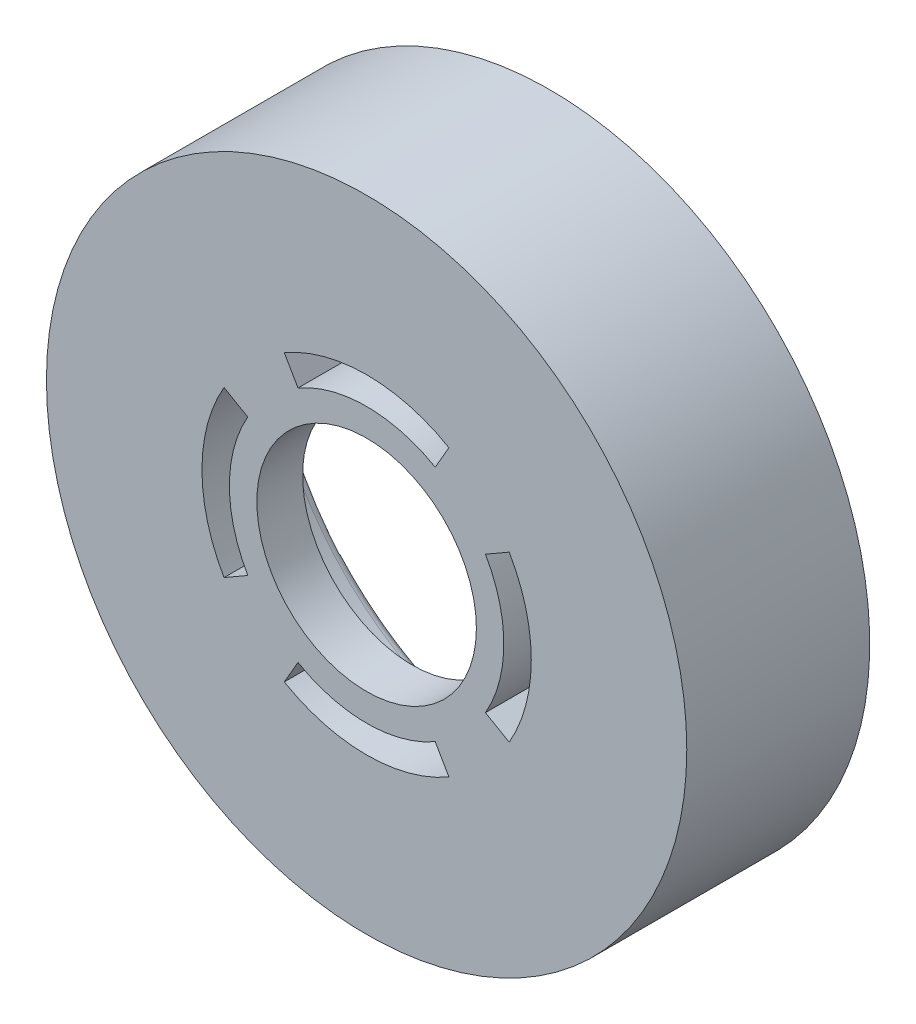
ISO-10303-21;
HEADER;
FILE_DESCRIPTION(('STEP AP214'),'2;1');
FILE_NAME('part.step','',(''),(''),'','','');
FILE_SCHEMA(('AUTOMOTIVE_DESIGN { 1 0 10303 214 1 1 1 1 }'));
ENDSEC;
DATA;
#1=APPLICATION_CONTEXT('core data for automotive mechanical design processes');
#2=APPLICATION_PROTOCOL_DEFINITION('international standard','automotive_design',2000,#1);
#3=PRODUCT_CONTEXT('',#1,'mechanical');
#4=PRODUCT('Part','Part','',(#3));
#5=PRODUCT_RELATED_PRODUCT_CATEGORY('part','',(#4));
#6=PRODUCT_DEFINITION_FORMATION('','',#4);
#7=PRODUCT_DEFINITION_CONTEXT('part definition',#1,'design');
#8=PRODUCT_DEFINITION('design','',#6,#7);
#9=PRODUCT_DEFINITION_SHAPE('','',#8);
#10=(LENGTH_UNIT() NAMED_UNIT(*) SI_UNIT(.MILLI.,.METRE.));
#11=(NAMED_UNIT(*) PLANE_ANGLE_UNIT() SI_UNIT($,.RADIAN.));
#12=(NAMED_UNIT(*) SI_UNIT($,.STERADIAN.) SOLID_ANGLE_UNIT());
#13=UNCERTAINTY_MEASURE_WITH_UNIT(LENGTH_MEASURE(1.E-05),#10,'distance_accuracy_value','');
#14=(GEOMETRIC_REPRESENTATION_CONTEXT(3) GLOBAL_UNCERTAINTY_ASSIGNED_CONTEXT((#13)) GLOBAL_UNIT_ASSIGNED_CONTEXT((#10,
#11,#12)) REPRESENTATION_CONTEXT('',''));
#15=CARTESIAN_POINT('',(0.,0.,0.));
#16=DIRECTION('',(0.,0.,1.));
#17=DIRECTION('',(1.,0.,0.));
#18=AXIS2_PLACEMENT_3D('',#15,#16,#17);
#19=CARTESIAN_POINT('',(0.,0.,0.));
#20=DIRECTION('',(0.,0.,1.));
#21=DIRECTION('',(1.,0.,0.));
#22=AXIS2_PLACEMENT_3D('',#19,#20,#21);
#23=PLANE('',#22);
#24=DIRECTION('',(-0.500000000000002,0.866025403784438,0.));
#25=VECTOR('',#24,1.);
#26=CARTESIAN_POINT('',(-7.50000000000002,12.9903810567666,0.));
#27=LINE('',#26,#25);
#28=CARTESIAN_POINT('',(-7.50000000000003,12.9903810567666,0.));
#29=VERTEX_POINT('',#28);
#30=CARTESIAN_POINT('',(-9.00000000000003,15.5884572681199,0.));
#31=VERTEX_POINT('',#30);
#32=EDGE_CURVE('E218',#29,#31,#27,.T.);
#33=ORIENTED_EDGE('',*,*,#32,.F.);
#34=CARTESIAN_POINT('',(0.,0.,0.));
#35=DIRECTION('',(0.,0.,1.));
#36=DIRECTION('',(-1.,0.,0.));
#37=AXIS2_PLACEMENT_3D('',#34,#35,#36);
#38=CIRCLE('',#37,15.);
#39=CARTESIAN_POINT('',(7.50000000000002,12.9903810567666,0.));
#40=VERTEX_POINT('',#39);
#41=EDGE_CURVE('E60',#40,#29,#38,.T.);
#42=ORIENTED_EDGE('',*,*,#41,.F.);
#43=DIRECTION('',(-0.500000000000001,-0.866025403784438,0.));
#44=VECTOR('',#43,1.);
#45=CARTESIAN_POINT('',(7.50000000000002,12.9903810567666,0.));
#46=LINE('',#45,#44);
#47=CARTESIAN_POINT('',(9.00000000000002,15.5884572681199,0.));
#48=VERTEX_POINT('',#47);
#49=EDGE_CURVE('E205',#48,#40,#46,.T.);
#50=ORIENTED_EDGE('',*,*,#49,.F.);
#51=CARTESIAN_POINT('',(0.,0.,0.));
#52=DIRECTION('',(0.,0.,-1.));
#53=DIRECTION('',(-1.,0.,0.));
#54=AXIS2_PLACEMENT_3D('',#51,#52,#53);
#55=CIRCLE('',#54,18.);
#56=EDGE_CURVE('E209',#31,#48,#55,.T.);
#57=ORIENTED_EDGE('',*,*,#56,.F.);
#58=EDGE_LOOP('',(#33,#42,#50,#57));
#59=FACE_BOUND('',#58,.T.);
#60=DIRECTION('',(-0.866025403784436,-0.500000000000005,0.));
#61=VECTOR('',#60,1.);
#62=CARTESIAN_POINT('',(-12.9903810567665,-7.50000000000007,0.));
#63=LINE('',#62,#61);
#64=CARTESIAN_POINT('',(-12.9903810567665,-7.50000000000007,0.));
#65=VERTEX_POINT('',#64);
#66=CARTESIAN_POINT('',(-15.5884572681199,-9.00000000000008,0.));
#67=VERTEX_POINT('',#66);
#68=EDGE_CURVE('E254',#65,#67,#63,.T.);
#69=ORIENTED_EDGE('',*,*,#68,.F.);
#70=CARTESIAN_POINT('',(0.,0.,0.));
#71=DIRECTION('',(0.,0.,1.));
#72=DIRECTION('',(-1.,0.,0.));
#73=AXIS2_PLACEMENT_3D('',#70,#71,#72);
#74=CIRCLE('',#73,15.);
#75=CARTESIAN_POINT('',(-12.9903810567666,7.49999999999997,0.));
#76=VERTEX_POINT('',#75);
#77=EDGE_CURVE('E68',#76,#65,#74,.T.);
#78=ORIENTED_EDGE('',*,*,#77,.F.);
#79=DIRECTION('',(0.86602540378444,-0.499999999999998,0.));
#80=VECTOR('',#79,1.);
#81=CARTESIAN_POINT('',(-12.9903810567666,7.49999999999997,0.));
#82=LINE('',#81,#80);
#83=CARTESIAN_POINT('',(-15.5884572681199,8.99999999999997,0.));
#84=VERTEX_POINT('',#83);
#85=EDGE_CURVE('E239',#84,#76,#82,.T.);
#86=ORIENTED_EDGE('',*,*,#85,.F.);
#87=CARTESIAN_POINT('',(0.,0.,0.));
#88=DIRECTION('',(0.,0.,-1.));
#89=DIRECTION('',(-1.,0.,0.));
#90=AXIS2_PLACEMENT_3D('',#87,#88,#89);
#91=CIRCLE('',#90,18.);
#92=EDGE_CURVE('E259',#67,#84,#91,.T.);
#93=ORIENTED_EDGE('',*,*,#92,.F.);
#94=EDGE_LOOP('',(#69,#78,#86,#93));
#95=FACE_BOUND('',#94,.T.);
#96=DIRECTION('',(0.500000000000008,-0.866025403784434,0.));
#97=VECTOR('',#96,1.);
#98=CARTESIAN_POINT('',(7.50000000000011,-12.9903810567665,0.));
#99=LINE('',#98,#97);
#100=CARTESIAN_POINT('',(7.50000000000012,-12.9903810567665,0.));
#101=VERTEX_POINT('',#100);
#102=CARTESIAN_POINT('',(9.00000000000013,-15.5884572681198,0.));
#103=VERTEX_POINT('',#102);
#104=EDGE_CURVE('E297',#101,#103,#99,.T.);
#105=ORIENTED_EDGE('',*,*,#104,.F.);
#106=CARTESIAN_POINT('',(0.,0.,0.));
#107=DIRECTION('',(0.,0.,1.));
#108=DIRECTION('',(-1.,0.,0.));
#109=AXIS2_PLACEMENT_3D('',#106,#107,#108);
#110=CIRCLE('',#109,15.);
#111=CARTESIAN_POINT('',(-7.49999999999993,-12.9903810567666,0.));
#112=VERTEX_POINT('',#111);
#113=EDGE_CURVE('E294',#112,#101,#110,.T.);
#114=ORIENTED_EDGE('',*,*,#113,.F.);
#115=DIRECTION('',(0.499999999999995,0.866025403784441,0.));
#116=VECTOR('',#115,1.);
#117=CARTESIAN_POINT('',(-7.49999999999993,-12.9903810567666,0.));
#118=LINE('',#117,#116);
#119=CARTESIAN_POINT('',(-8.99999999999992,-15.5884572681199,0.));
#120=VERTEX_POINT('',#119);
#121=EDGE_CURVE('E281',#120,#112,#118,.T.);
#122=ORIENTED_EDGE('',*,*,#121,.F.);
#123=CARTESIAN_POINT('',(0.,0.,0.));
#124=DIRECTION('',(0.,0.,-1.));
#125=DIRECTION('',(-1.,0.,0.));
#126=AXIS2_PLACEMENT_3D('',#123,#124,#125);
#127=CIRCLE('',#126,18.);
#128=EDGE_CURVE('E302',#103,#120,#127,.T.);
#129=ORIENTED_EDGE('',*,*,#128,.F.);
#130=EDGE_LOOP('',(#105,#114,#122,#129));
#131=FACE_BOUND('',#130,.T.);
#132=DIRECTION('',(0.866025403784432,0.500000000000011,0.));
#133=VECTOR('',#132,1.);
#134=CARTESIAN_POINT('',(12.9903810567665,7.50000000000016,0.));
#135=LINE('',#134,#133);
#136=CARTESIAN_POINT('',(12.9903810567665,7.50000000000016,0.));
#137=VERTEX_POINT('',#136);
#138=CARTESIAN_POINT('',(15.5884572681198,9.0000000000002,0.));
#139=VERTEX_POINT('',#138);
#140=EDGE_CURVE('E341',#137,#139,#135,.T.);
#141=ORIENTED_EDGE('',*,*,#140,.F.);
#142=CARTESIAN_POINT('',(0.,0.,0.));
#143=DIRECTION('',(0.,0.,1.));
#144=DIRECTION('',(-1.,0.,0.));
#145=AXIS2_PLACEMENT_3D('',#142,#143,#144);
#146=CIRCLE('',#145,15.);
#147=CARTESIAN_POINT('',(12.9903810567666,-7.49999999999988,0.));
#148=VERTEX_POINT('',#147);
#149=EDGE_CURVE('E338',#148,#137,#146,.T.);
#150=ORIENTED_EDGE('',*,*,#149,.F.);
#151=DIRECTION('',(-0.866025403784443,0.499999999999992,0.));
#152=VECTOR('',#151,1.);
#153=CARTESIAN_POINT('',(12.9903810567666,-7.49999999999988,0.));
#154=LINE('',#153,#152);
#155=CARTESIAN_POINT('',(15.58845726812,-8.99999999999986,0.));
#156=VERTEX_POINT('',#155);
#157=EDGE_CURVE('E325',#156,#148,#154,.T.);
#158=ORIENTED_EDGE('',*,*,#157,.F.);
#159=CARTESIAN_POINT('',(0.,0.,0.));
#160=DIRECTION('',(0.,0.,-1.));
#161=DIRECTION('',(-1.,0.,0.));
#162=AXIS2_PLACEMENT_3D('',#159,#160,#161);
#163=CIRCLE('',#162,18.);
#164=EDGE_CURVE('E345',#139,#156,#163,.T.);
#165=ORIENTED_EDGE('',*,*,#164,.F.);
#166=EDGE_LOOP('',(#141,#150,#158,#165));
#167=FACE_BOUND('',#166,.T.);
#168=CARTESIAN_POINT('',(0.,0.,0.));
#169=DIRECTION('',(0.,0.,1.));
#170=DIRECTION('',(1.,0.,0.));
#171=AXIS2_PLACEMENT_3D('',#168,#169,#170);
#172=CIRCLE('',#171,12.);
#173=CARTESIAN_POINT('',(12.,0.,0.));
#174=VERTEX_POINT('',#173);
#175=EDGE_CURVE('E402',#174,#174,#172,.T.);
#176=ORIENTED_EDGE('',*,*,#175,.T.);
#177=EDGE_LOOP('',(#176));
#178=FACE_BOUND('',#177,.T.);
#179=CARTESIAN_POINT('',(0.,0.,0.));
#180=DIRECTION('',(0.,0.,-1.));
#181=DIRECTION('',(-1.,0.,0.));
#182=AXIS2_PLACEMENT_3D('',#179,#180,#181);
#183=CIRCLE('',#182,30.05);
#184=CARTESIAN_POINT('',(-30.05,0.,0.));
#185=VERTEX_POINT('',#184);
#186=EDGE_CURVE('E367',#185,#185,#183,.T.);
#187=ORIENTED_EDGE('',*,*,#186,.T.);
#188=EDGE_LOOP('',(#187));
#189=FACE_BOUND('',#188,.T.);
#190=ADVANCED_FACE('F38',(#59,#95,#131,#167,#178,#189),#23,.F.);
#191=CARTESIAN_POINT('',(0.,0.,5.));
#192=DIRECTION('',(0.,0.,1.));
#193=DIRECTION('',(1.,0.,0.));
#194=AXIS2_PLACEMENT_3D('',#191,#192,#193);
#195=PLANE('',#194);
#196=CARTESIAN_POINT('',(0.,0.,5.));
#197=DIRECTION('',(0.,0.,1.));
#198=DIRECTION('',(-1.,0.,0.));
#199=AXIS2_PLACEMENT_3D('',#196,#197,#198);
#200=CIRCLE('',#199,15.);
#201=CARTESIAN_POINT('',(7.50000000000002,12.9903810567666,5.));
#202=VERTEX_POINT('',#201);
#203=CARTESIAN_POINT('',(-7.50000000000002,12.9903810567666,5.));
#204=VERTEX_POINT('',#203);
#205=EDGE_CURVE('E183',#202,#204,#200,.T.);
#206=ORIENTED_EDGE('',*,*,#205,.T.);
#207=DIRECTION('',(-0.500000000000002,0.866025403784438,0.));
#208=VECTOR('',#207,1.);
#209=CARTESIAN_POINT('',(-7.50000000000002,12.9903810567666,5.));
#210=LINE('',#209,#208);
#211=CARTESIAN_POINT('',(-9.00000000000003,15.5884572681199,5.));
#212=VERTEX_POINT('',#211);
#213=EDGE_CURVE('E194',#204,#212,#210,.T.);
#214=ORIENTED_EDGE('',*,*,#213,.T.);
#215=CARTESIAN_POINT('',(0.,0.,5.));
#216=DIRECTION('',(0.,0.,-1.));
#217=DIRECTION('',(-1.,0.,0.));
#218=AXIS2_PLACEMENT_3D('',#215,#216,#217);
#219=CIRCLE('',#218,18.);
#220=CARTESIAN_POINT('',(9.00000000000002,15.5884572681199,5.));
#221=VERTEX_POINT('',#220);
#222=EDGE_CURVE('E199',#212,#221,#219,.T.);
#223=ORIENTED_EDGE('',*,*,#222,.T.);
#224=DIRECTION('',(-0.500000000000001,-0.866025403784438,0.));
#225=VECTOR('',#224,1.);
#226=CARTESIAN_POINT('',(7.50000000000002,12.9903810567666,5.));
#227=LINE('',#226,#225);
#228=EDGE_CURVE('E190',#221,#202,#227,.T.);
#229=ORIENTED_EDGE('',*,*,#228,.T.);
#230=EDGE_LOOP('',(#206,#214,#223,#229));
#231=FACE_BOUND('',#230,.T.);
#232=CARTESIAN_POINT('',(0.,0.,5.));
#233=DIRECTION('',(0.,0.,1.));
#234=DIRECTION('',(-1.,0.,0.));
#235=AXIS2_PLACEMENT_3D('',#232,#233,#234);
#236=CIRCLE('',#235,15.);
#237=CARTESIAN_POINT('',(-12.9903810567666,7.49999999999997,5.));
#238=VERTEX_POINT('',#237);
#239=CARTESIAN_POINT('',(-12.9903810567665,-7.50000000000007,5.));
#240=VERTEX_POINT('',#239);
#241=EDGE_CURVE('E234',#238,#240,#236,.T.);
#242=ORIENTED_EDGE('',*,*,#241,.T.);
#243=DIRECTION('',(-0.866025403784436,-0.500000000000005,0.));
#244=VECTOR('',#243,1.);
#245=CARTESIAN_POINT('',(-12.9903810567665,-7.50000000000007,5.));
#246=LINE('',#245,#244);
#247=CARTESIAN_POINT('',(-15.5884572681199,-9.00000000000008,5.));
#248=VERTEX_POINT('',#247);
#249=EDGE_CURVE('E238',#240,#248,#246,.T.);
#250=ORIENTED_EDGE('',*,*,#249,.T.);
#251=CARTESIAN_POINT('',(0.,0.,5.));
#252=DIRECTION('',(0.,0.,-1.));
#253=DIRECTION('',(-1.,0.,0.));
#254=AXIS2_PLACEMENT_3D('',#251,#252,#253);
#255=CIRCLE('',#254,18.);
#256=CARTESIAN_POINT('',(-15.5884572681199,8.99999999999997,5.));
#257=VERTEX_POINT('',#256);
#258=EDGE_CURVE('E243',#248,#257,#255,.T.);
#259=ORIENTED_EDGE('',*,*,#258,.T.);
#260=DIRECTION('',(0.86602540378444,-0.499999999999998,0.));
#261=VECTOR('',#260,1.);
#262=CARTESIAN_POINT('',(-12.9903810567666,7.49999999999997,5.));
#263=LINE('',#262,#261);
#264=EDGE_CURVE('E247',#257,#238,#263,.T.);
#265=ORIENTED_EDGE('',*,*,#264,.T.);
#266=EDGE_LOOP('',(#242,#250,#259,#265));
#267=FACE_BOUND('',#266,.T.);
#268=CARTESIAN_POINT('',(0.,0.,5.));
#269=DIRECTION('',(0.,0.,1.));
#270=DIRECTION('',(-1.,0.,0.));
#271=AXIS2_PLACEMENT_3D('',#268,#269,#270);
#272=CIRCLE('',#271,15.);
#273=CARTESIAN_POINT('',(-7.49999999999993,-12.9903810567666,5.));
#274=VERTEX_POINT('',#273);
#275=CARTESIAN_POINT('',(7.50000000000011,-12.9903810567665,5.));
#276=VERTEX_POINT('',#275);
#277=EDGE_CURVE('E276',#274,#276,#272,.T.);
#278=ORIENTED_EDGE('',*,*,#277,.T.);
#279=DIRECTION('',(0.500000000000008,-0.866025403784434,0.));
#280=VECTOR('',#279,1.);
#281=CARTESIAN_POINT('',(7.50000000000011,-12.9903810567665,5.));
#282=LINE('',#281,#280);
#283=CARTESIAN_POINT('',(9.00000000000014,-15.5884572681198,5.));
#284=VERTEX_POINT('',#283);
#285=EDGE_CURVE('E280',#276,#284,#282,.T.);
#286=ORIENTED_EDGE('',*,*,#285,.T.);
#287=CARTESIAN_POINT('',(0.,0.,5.));
#288=DIRECTION('',(0.,0.,-1.));
#289=DIRECTION('',(-1.,0.,0.));
#290=AXIS2_PLACEMENT_3D('',#287,#288,#289);
#291=CIRCLE('',#290,18.);
#292=CARTESIAN_POINT('',(-8.99999999999992,-15.5884572681199,5.));
#293=VERTEX_POINT('',#292);
#294=EDGE_CURVE('E285',#284,#293,#291,.T.);
#295=ORIENTED_EDGE('',*,*,#294,.T.);
#296=DIRECTION('',(0.499999999999995,0.866025403784441,0.));
#297=VECTOR('',#296,1.);
#298=CARTESIAN_POINT('',(-7.49999999999993,-12.9903810567666,5.));
#299=LINE('',#298,#297);
#300=EDGE_CURVE('E289',#293,#274,#299,.T.);
#301=ORIENTED_EDGE('',*,*,#300,.T.);
#302=EDGE_LOOP('',(#278,#286,#295,#301));
#303=FACE_BOUND('',#302,.T.);
#304=CARTESIAN_POINT('',(0.,0.,5.));
#305=DIRECTION('',(0.,0.,1.));
#306=DIRECTION('',(-1.,0.,0.));
#307=AXIS2_PLACEMENT_3D('',#304,#305,#306);
#308=CIRCLE('',#307,15.);
#309=CARTESIAN_POINT('',(12.9903810567666,-7.49999999999988,5.));
#310=VERTEX_POINT('',#309);
#311=CARTESIAN_POINT('',(12.9903810567665,7.50000000000016,5.));
#312=VERTEX_POINT('',#311);
#313=EDGE_CURVE('E320',#310,#312,#308,.T.);
#314=ORIENTED_EDGE('',*,*,#313,.T.);
#315=DIRECTION('',(0.866025403784432,0.500000000000011,0.));
#316=VECTOR('',#315,1.);
#317=CARTESIAN_POINT('',(12.9903810567665,7.50000000000016,5.));
#318=LINE('',#317,#316);
#319=CARTESIAN_POINT('',(15.5884572681198,9.00000000000019,5.));
#320=VERTEX_POINT('',#319);
#321=EDGE_CURVE('E324',#312,#320,#318,.T.);
#322=ORIENTED_EDGE('',*,*,#321,.T.);
#323=CARTESIAN_POINT('',(0.,0.,5.));
#324=DIRECTION('',(0.,0.,-1.));
#325=DIRECTION('',(-1.,0.,0.));
#326=AXIS2_PLACEMENT_3D('',#323,#324,#325);
#327=CIRCLE('',#326,18.);
#328=CARTESIAN_POINT('',(15.58845726812,-8.99999999999986,5.));
#329=VERTEX_POINT('',#328);
#330=EDGE_CURVE('E329',#320,#329,#327,.T.);
#331=ORIENTED_EDGE('',*,*,#330,.T.);
#332=DIRECTION('',(-0.866025403784443,0.499999999999992,0.));
#333=VECTOR('',#332,1.);
#334=CARTESIAN_POINT('',(12.9903810567666,-7.49999999999988,5.));
#335=LINE('',#334,#333);
#336=EDGE_CURVE('E333',#329,#310,#335,.T.);
#337=ORIENTED_EDGE('',*,*,#336,.T.);
#338=EDGE_LOOP('',(#314,#322,#331,#337));
#339=FACE_BOUND('',#338,.T.);
#340=CARTESIAN_POINT('',(0.,0.,5.));
#341=DIRECTION('',(0.,0.,1.));
#342=DIRECTION('',(1.,0.,0.));
#343=AXIS2_PLACEMENT_3D('',#340,#341,#342);
#344=CIRCLE('',#343,35.);
#345=CARTESIAN_POINT('',(35.,0.,5.));
#346=VERTEX_POINT('',#345);
#347=EDGE_CURVE('E407',#346,#346,#344,.T.);
#348=ORIENTED_EDGE('',*,*,#347,.T.);
#349=EDGE_LOOP('',(#348));
#350=FACE_BOUND('',#349,.T.);
#351=CARTESIAN_POINT('',(0.,0.,5.));
#352=DIRECTION('',(0.,0.,1.));
#353=DIRECTION('',(1.,0.,0.));
#354=AXIS2_PLACEMENT_3D('',#351,#352,#353);
#355=CIRCLE('',#354,12.);
#356=CARTESIAN_POINT('',(12.,0.,5.));
#357=VERTEX_POINT('',#356);
#358=EDGE_CURVE('E403',#357,#357,#355,.T.);
#359=ORIENTED_EDGE('',*,*,#358,.F.);
#360=EDGE_LOOP('',(#359));
#361=FACE_BOUND('',#360,.T.);
#362=ADVANCED_FACE('F201',(#231,#267,#303,#339,#350,#361),#195,.T.);
#363=CARTESIAN_POINT('',(0.,0.,5.));
#364=DIRECTION('',(0.,0.,-1.));
#365=DIRECTION('',(-1.,0.,0.));
#366=AXIS2_PLACEMENT_3D('',#363,#364,#365);
#367=CYLINDRICAL_SURFACE('',#366,35.);
#368=ORIENTED_EDGE('',*,*,#347,.F.);
#369=EDGE_LOOP('',(#368));
#370=FACE_BOUND('',#369,.T.);
#371=CARTESIAN_POINT('',(0.,0.,-15.));
#372=DIRECTION('',(0.,0.,-1.));
#373=DIRECTION('',(-1.,0.,0.));
#374=AXIS2_PLACEMENT_3D('',#371,#372,#373);
#375=CIRCLE('',#374,35.);
#376=CARTESIAN_POINT('',(-35.,0.,-15.));
#377=VERTEX_POINT('',#376);
#378=EDGE_CURVE('E398',#377,#377,#375,.T.);
#379=ORIENTED_EDGE('',*,*,#378,.F.);
#380=EDGE_LOOP('',(#379));
#381=FACE_BOUND('',#380,.T.);
#382=ADVANCED_FACE('F463',(#370,#381),#367,.T.);
#383=CARTESIAN_POINT('',(0.,0.,5.));
#384=DIRECTION('',(0.,0.,-1.));
#385=DIRECTION('',(-1.,0.,0.));
#386=AXIS2_PLACEMENT_3D('',#383,#384,#385);
#387=CYLINDRICAL_SURFACE('',#386,12.);
#388=ORIENTED_EDGE('',*,*,#358,.T.);
#389=EDGE_LOOP('',(#388));
#390=FACE_BOUND('',#389,.T.);
#391=ORIENTED_EDGE('',*,*,#175,.F.);
#392=EDGE_LOOP('',(#391));
#393=FACE_BOUND('',#392,.T.);
#394=ADVANCED_FACE('F459',(#390,#393),#387,.F.);
#395=CARTESIAN_POINT('',(0.,0.,-15.));
#396=DIRECTION('',(0.,0.,-1.));
#397=DIRECTION('',(-1.,0.,0.));
#398=AXIS2_PLACEMENT_3D('',#395,#396,#397);
#399=PLANE('',#398);
#400=CARTESIAN_POINT('',(-1.83547080668457E-12,-32.5,-15.));
#401=DIRECTION('',(0.,0.,-1.));
#402=DIRECTION('',(-1.,0.,0.));
#403=AXIS2_PLACEMENT_3D('',#400,#401,#402);
#404=CIRCLE('',#403,1.55000000000197);
#405=CARTESIAN_POINT('',(0.535344826111361,-31.0453846153846,-15.));
#406=VERTEX_POINT('',#405);
#407=CARTESIAN_POINT('',(-0.535344826114868,-31.0453846153845,-15.));
#408=VERTEX_POINT('',#407);
#409=EDGE_CURVE('E384',#406,#408,#404,.T.);
#410=ORIENTED_EDGE('',*,*,#409,.F.);
#411=CARTESIAN_POINT('',(0.,0.,-15.));
#412=DIRECTION('',(0.,0.,-1.));
#413=DIRECTION('',(-1.,0.,0.));
#414=AXIS2_PLACEMENT_3D('',#411,#412,#413);
#415=CIRCLE('',#414,31.05);
#416=CARTESIAN_POINT('',(31.0453846153845,-0.535344826114989,-15.));
#417=VERTEX_POINT('',#416);
#418=EDGE_CURVE('E427',#406,#417,#415,.F.);
#419=ORIENTED_EDGE('',*,*,#418,.T.);
#420=CARTESIAN_POINT('',(32.4999999999991,-9.21715505439516E-13,-15.));
#421=DIRECTION('',(0.,0.,-1.));
#422=DIRECTION('',(-1.,0.,0.));
#423=AXIS2_PLACEMENT_3D('',#420,#421,#422);
#424=CIRCLE('',#423,1.55000000000148);
#425=CARTESIAN_POINT('',(31.0453846153845,0.535344826113227,-15.));
#426=VERTEX_POINT('',#425);
#427=EDGE_CURVE('E228',#426,#417,#424,.T.);
#428=ORIENTED_EDGE('',*,*,#427,.F.);
#429=CARTESIAN_POINT('',(0.,0.,-15.));
#430=DIRECTION('',(0.,0.,-1.));
#431=DIRECTION('',(-1.,0.,0.));
#432=AXIS2_PLACEMENT_3D('',#429,#430,#431);
#433=CIRCLE('',#432,31.05);
#434=CARTESIAN_POINT('',(0.535344826107665,31.0453846153846,-15.));
#435=VERTEX_POINT('',#434);
#436=EDGE_CURVE('E424',#426,#435,#433,.F.);
#437=ORIENTED_EDGE('',*,*,#436,.T.);
#438=CARTESIAN_POINT('',(0.,32.5,-15.));
#439=DIRECTION('',(0.,0.,-1.));
#440=DIRECTION('',(-1.,0.,0.));
#441=AXIS2_PLACEMENT_3D('',#438,#439,#440);
#442=CIRCLE('',#441,1.55);
#443=CARTESIAN_POINT('',(-0.535344826107665,31.0453846153846,-15.));
#444=VERTEX_POINT('',#443);
#445=EDGE_CURVE('E368',#444,#435,#442,.T.);
#446=ORIENTED_EDGE('',*,*,#445,.F.);
#447=CARTESIAN_POINT('',(0.,0.,-15.));
#448=DIRECTION('',(0.,0.,-1.));
#449=DIRECTION('',(-1.,0.,0.));
#450=AXIS2_PLACEMENT_3D('',#447,#448,#449);
#451=CIRCLE('',#450,31.05);
#452=CARTESIAN_POINT('',(-31.0453846153846,0.535344826108146,-15.));
#453=VERTEX_POINT('',#452);
#454=EDGE_CURVE('E421',#444,#453,#451,.F.);
#455=ORIENTED_EDGE('',*,*,#454,.T.);
#456=CARTESIAN_POINT('',(-32.5000000000009,9.17735403342287E-13,-15.));
#457=DIRECTION('',(0.,0.,-1.));
#458=DIRECTION('',(-1.,0.,0.));
#459=AXIS2_PLACEMENT_3D('',#456,#457,#458);
#460=CIRCLE('',#459,1.55000000000072);
#461=CARTESIAN_POINT('',(-31.0453846153846,-0.535344826106392,-15.));
#462=VERTEX_POINT('',#461);
#463=EDGE_CURVE('E376',#462,#453,#460,.T.);
#464=ORIENTED_EDGE('',*,*,#463,.F.);
#465=CARTESIAN_POINT('',(0.,0.,-15.));
#466=DIRECTION('',(0.,0.,-1.));
#467=DIRECTION('',(-1.,0.,0.));
#468=AXIS2_PLACEMENT_3D('',#465,#466,#467);
#469=CIRCLE('',#468,31.05);
#470=EDGE_CURVE('E418',#462,#408,#469,.F.);
#471=ORIENTED_EDGE('',*,*,#470,.T.);
#472=EDGE_LOOP('',(#410,#419,#428,#437,#446,#455,#464,#471));
#473=FACE_BOUND('',#472,.T.);
#474=ORIENTED_EDGE('',*,*,#378,.T.);
#475=EDGE_LOOP('',(#474));
#476=FACE_BOUND('',#475,.T.);
#477=ADVANCED_FACE('F455',(#473,#476),#399,.T.);
#478=CARTESIAN_POINT('',(0.,0.,-15.));
#479=DIRECTION('',(0.,0.,1.));
#480=DIRECTION('',(1.,0.,0.));
#481=AXIS2_PLACEMENT_3D('',#478,#479,#480);
#482=CYLINDRICAL_SURFACE('',#481,30.05);
#483=CARTESIAN_POINT('',(0.,0.,-14.));
#484=DIRECTION('',(0.,0.,-1.));
#485=DIRECTION('',(-1.,0.,0.));
#486=AXIS2_PLACEMENT_3D('',#483,#484,#485);
#487=CIRCLE('',#486,30.05);
#488=CARTESIAN_POINT('',(-30.05,0.,-14.));
#489=VERTEX_POINT('',#488);
#490=EDGE_CURVE('E414',#489,#489,#487,.T.);
#491=ORIENTED_EDGE('',*,*,#490,.T.);
#492=EDGE_LOOP('',(#491));
#493=FACE_BOUND('',#492,.T.);
#494=ORIENTED_EDGE('',*,*,#186,.F.);
#495=EDGE_LOOP('',(#494));
#496=FACE_BOUND('',#495,.T.);
#497=ADVANCED_FACE('F451',(#493,#496),#482,.F.);
#498=CARTESIAN_POINT('',(32.4999999999991,-9.21715505439516E-13,-5.));
#499=DIRECTION('',(0.,0.,-1.));
#500=DIRECTION('',(-1.,0.,0.));
#501=AXIS2_PLACEMENT_3D('',#498,#499,#500);
#502=CYLINDRICAL_SURFACE('',#501,1.55000000000148);
#503=CARTESIAN_POINT('',(32.4999999999991,-9.21715505439516E-13,-5.));
#504=DIRECTION('',(0.,0.,-1.));
#505=DIRECTION('',(-1.,0.,0.));
#506=AXIS2_PLACEMENT_3D('',#503,#504,#505);
#507=CIRCLE('',#506,1.55000000000148);
#508=CARTESIAN_POINT('',(30.9499999999976,-9.21715505439516E-13,-5.));
#509=VERTEX_POINT('',#508);
#510=EDGE_CURVE('E388',#509,#509,#507,.T.);
#511=ORIENTED_EDGE('',*,*,#510,.F.);
#512=EDGE_LOOP('',(#511));
#513=FACE_BOUND('',#512,.T.);
#514=ORIENTED_EDGE('',*,*,#427,.T.);
#515=CARTESIAN_POINT('',(31.0453846153845,-0.535344826114989,-15.));
#516=CARTESIAN_POINT('',(31.0307383869997,-0.495560014249698,-14.9999826692012));
#517=CARTESIAN_POINT('',(31.0177330548798,-0.455175578224388,-14.9996467246057));
#518=CARTESIAN_POINT('',(30.9950725448644,-0.373479727093672,-14.9986855686351));
#519=CARTESIAN_POINT('',(30.9854174143775,-0.332168298879239,-14.9980603531668));
#520=CARTESIAN_POINT('',(30.9695129884534,-0.248823229093558,-14.9968676541164));
#521=CARTESIAN_POINT('',(30.9632693341293,-0.206788509158926,-14.9963002674104));
#522=CARTESIAN_POINT('',(30.9542530788073,-0.122349646109064,-14.9954377750089));
#523=CARTESIAN_POINT('',(30.9514802497615,-0.0799455274492649,-14.9951426514248));
#524=CARTESIAN_POINT('',(30.9494000413959,0.0060660291117783,-14.9949249184645));
#525=CARTESIAN_POINT('',(30.9501853162059,0.0496758985104902,-14.9950122668137));
#526=CARTESIAN_POINT('',(30.955420862965,0.136675617082505,-14.9955454461856));
#527=CARTESIAN_POINT('',(30.9598731005956,0.180065335689092,-14.9959914694736));
#528=CARTESIAN_POINT('',(30.9786772411035,0.309192574073585,-14.9976518800101));
#529=CARTESIAN_POINT('',(30.9984681568341,0.394247749436495,-14.9991895872164));
#530=CARTESIAN_POINT('',(31.0283519271968,0.486682209622534,-14.9998458579856));
#531=CARTESIAN_POINT('',(31.031623661036,0.496465468483389,-14.9999021305463));
#532=CARTESIAN_POINT('',(31.0383595917298,0.515958287580456,-14.9999794862789));
#533=CARTESIAN_POINT('',(31.0418236578275,0.525667892907062,-15.0000005930627));
#534=CARTESIAN_POINT('',(31.0453846153845,0.535344826113227,-15.));
#535=B_SPLINE_CURVE_WITH_KNOTS('',3,(#515,#516,#517,#518,#519,#520,#521,#522,#523,#524,#525,
#526,#527,#528,#529,#530,#531,#532,#533,#534),.UNSPECIFIED.,.F.,.F.,(4,2,2,2,2,2,2,2,2,4),(0.,
0.127143058476894,0.254287916077298,0.381642385130178,0.508988486014026,0.639669501712304,
0.770420614814959,1.03085621097554,1.06180485262347,1.09273270553381),.UNSPECIFIED.);
#536=EDGE_CURVE('E431',#417,#426,#535,.T.);
#537=ORIENTED_EDGE('',*,*,#536,.T.);
#538=EDGE_LOOP('',(#514,#537));
#539=FACE_BOUND('',#538,.T.);
#540=ADVANCED_FACE('F445',(#513,#539),#502,.F.);
#541=CARTESIAN_POINT('',(0.,0.,-5.));
#542=DIRECTION('',(0.,0.,-1.));
#543=DIRECTION('',(-1.,0.,0.));
#544=AXIS2_PLACEMENT_3D('',#541,#542,#543);
#545=PLANE('',#544);
#546=ORIENTED_EDGE('',*,*,#510,.T.);
#547=EDGE_LOOP('',(#546));
#548=FACE_BOUND('',#547,.T.);
#549=ADVANCED_FACE('F450',(#548),#545,.T.);
#550=CARTESIAN_POINT('',(-1.83547080668457E-12,-32.5,-5.));
#551=DIRECTION('',(0.,0.,-1.));
#552=DIRECTION('',(-1.,0.,0.));
#553=AXIS2_PLACEMENT_3D('',#550,#551,#552);
#554=CYLINDRICAL_SURFACE('',#553,1.55000000000197);
#555=CARTESIAN_POINT('',(-1.83547080668457E-12,-32.5,-5.));
#556=DIRECTION('',(0.,0.,-1.));
#557=DIRECTION('',(-1.,0.,0.));
#558=AXIS2_PLACEMENT_3D('',#555,#556,#557);
#559=CIRCLE('',#558,1.55000000000197);
#560=CARTESIAN_POINT('',(-1.55000000000381,-32.5,-5.));
#561=VERTEX_POINT('',#560);
#562=EDGE_CURVE('E380',#561,#561,#559,.T.);
#563=ORIENTED_EDGE('',*,*,#562,.F.);
#564=EDGE_LOOP('',(#563));
#565=FACE_BOUND('',#564,.T.);
#566=ORIENTED_EDGE('',*,*,#409,.T.);
#567=CARTESIAN_POINT('',(-0.535344826114868,-31.0453846153845,-15.));
#568=CARTESIAN_POINT('',(-0.495560014249567,-31.0307383869997,-14.9999826692012));
#569=CARTESIAN_POINT('',(-0.455175578224248,-31.0177330548798,-14.9996467246057));
#570=CARTESIAN_POINT('',(-0.373479727093517,-30.9950725448645,-14.9986855686351));
#571=CARTESIAN_POINT('',(-0.332168298879077,-30.9854174143776,-14.9980603531668));
#572=CARTESIAN_POINT('',(-0.248823229093384,-30.9695129884536,-14.9968676541164));
#573=CARTESIAN_POINT('',(-0.206788509158747,-30.9632693341296,-14.9963002674105));
#574=CARTESIAN_POINT('',(-0.122349646108877,-30.9542530788077,-14.995437775009));
#575=CARTESIAN_POINT('',(-0.0799455274490759,-30.9514802497618,-14.9951426514248));
#576=CARTESIAN_POINT('',(0.00606602911198425,-30.9494000413963,-14.9949249184646));
#577=CARTESIAN_POINT('',(0.0496758985107106,-30.9501853162063,-14.9950122668138));
#578=CARTESIAN_POINT('',(0.136675617082752,-30.9554208629655,-14.9955454461857));
#579=CARTESIAN_POINT('',(0.180065335689351,-30.9598731005961,-14.9959914694736));
#580=CARTESIAN_POINT('',(0.309192574073874,-30.9786772411041,-14.9976518800101));
#581=CARTESIAN_POINT('',(0.3942477494368,-30.9984681568348,-14.9991895872165));
#582=CARTESIAN_POINT('',(0.486682209622474,-31.0283519271975,-14.9998458579856));
#583=CARTESIAN_POINT('',(0.496465468482963,-31.0316236610365,-14.9999021305463));
#584=CARTESIAN_POINT('',(0.515958287579305,-31.0383595917301,-14.9999794862789));
#585=CARTESIAN_POINT('',(0.525667892905552,-31.0418236578277,-15.0000005930627));
#586=CARTESIAN_POINT('',(0.535344826111361,-31.0453846153846,-15.));
#587=B_SPLINE_CURVE_WITH_KNOTS('',3,(#567,#568,#569,#570,#571,#572,#573,#574,#575,#576,#577,
#578,#579,#580,#581,#582,#583,#584,#585,#586),.UNSPECIFIED.,.F.,.F.,(4,2,2,2,2,2,2,2,2,4),(0.,
0.127143058476888,0.254287916077288,0.38164238513017,0.508988486014019,0.639669501712342,
0.770420614815043,1.03085621097571,1.06180485262248,1.09273270553168),.UNSPECIFIED.);
#588=EDGE_CURVE('E11',#408,#406,#587,.T.);
#589=ORIENTED_EDGE('',*,*,#588,.T.);
#590=EDGE_LOOP('',(#566,#589));
#591=FACE_BOUND('',#590,.T.);
#592=ADVANCED_FACE('F514',(#565,#591),#554,.F.);
#593=CARTESIAN_POINT('',(0.,0.,-5.));
#594=DIRECTION('',(0.,0.,-1.));
#595=DIRECTION('',(-1.,0.,0.));
#596=AXIS2_PLACEMENT_3D('',#593,#594,#595);
#597=PLANE('',#596);
#598=ORIENTED_EDGE('',*,*,#562,.T.);
#599=EDGE_LOOP('',(#598));
#600=FACE_BOUND('',#599,.T.);
#601=ADVANCED_FACE('F521',(#600),#597,.T.);
#602=CARTESIAN_POINT('',(-32.5000000000009,9.17735403342287E-13,-5.));
#603=DIRECTION('',(0.,0.,-1.));
#604=DIRECTION('',(-1.,0.,0.));
#605=AXIS2_PLACEMENT_3D('',#602,#603,#604);
#606=CYLINDRICAL_SURFACE('',#605,1.55000000000072);
#607=CARTESIAN_POINT('',(-32.5000000000009,9.17735403342287E-13,-5.));
#608=DIRECTION('',(0.,0.,-1.));
#609=DIRECTION('',(-1.,0.,0.));
#610=AXIS2_PLACEMENT_3D('',#607,#608,#609);
#611=CIRCLE('',#610,1.55000000000072);
#612=CARTESIAN_POINT('',(-34.0500000000016,9.17735403342287E-13,-5.));
#613=VERTEX_POINT('',#612);
#614=EDGE_CURVE('E372',#613,#613,#611,.T.);
#615=ORIENTED_EDGE('',*,*,#614,.F.);
#616=EDGE_LOOP('',(#615));
#617=FACE_BOUND('',#616,.T.);
#618=ORIENTED_EDGE('',*,*,#463,.T.);
#619=CARTESIAN_POINT('',(-31.0453846153846,0.535344826108146,-15.));
#620=CARTESIAN_POINT('',(-31.030738387,0.495560014242792,-14.9999826692012));
#621=CARTESIAN_POINT('',(-31.0177330548802,0.455175578217426,-14.9996467246057));
#622=CARTESIAN_POINT('',(-30.9950725448652,0.373479727086611,-14.9986855686351));
#623=CARTESIAN_POINT('',(-30.9854174143785,0.332168298872136,-14.9980603531669));
#624=CARTESIAN_POINT('',(-30.9695129884548,0.24882322908638,-14.9968676541165));
#625=CARTESIAN_POINT('',(-30.9632693341309,0.206788509151715,-14.9963002674106));
#626=CARTESIAN_POINT('',(-30.9542530788094,0.122349646101802,-14.9954377750091));
#627=CARTESIAN_POINT('',(-30.9514802497637,0.0799455274419859,-14.995142651425));
#628=CARTESIAN_POINT('',(-30.9494000413985,-0.0060660291190561,-14.9949249184648));
#629=CARTESIAN_POINT('',(-30.9501853162087,-0.0496758985177488,-14.995012266814));
#630=CARTESIAN_POINT('',(-30.9554208629682,-0.136675617089709,-14.995545446186));
#631=CARTESIAN_POINT('',(-30.959873100599,-0.180065335696259,-14.9959914694739));
#632=CARTESIAN_POINT('',(-30.9786772411075,-0.309192574080607,-14.9976518800104));
#633=CARTESIAN_POINT('',(-30.9984681568385,-0.394247749443387,-14.9991895872167));
#634=CARTESIAN_POINT('',(-31.028351927201,-0.486682209626963,-14.9998458579857));
#635=CARTESIAN_POINT('',(-31.0316236610393,-0.496465468485542,-14.9999021305463));
#636=CARTESIAN_POINT('',(-31.0383595917316,-0.51595828757809,-14.9999794862789));
#637=CARTESIAN_POINT('',(-31.0418236578285,-0.525667892902453,-15.0000005930627));
#638=CARTESIAN_POINT('',(-31.0453846153846,-0.535344826106392,-15.));
#639=B_SPLINE_CURVE_WITH_KNOTS('',3,(#619,#620,#621,#622,#623,#624,#625,#626,#627,#628,#629,
#630,#631,#632,#633,#634,#635,#636,#637,#638),.UNSPECIFIED.,.F.,.F.,(4,2,2,2,2,2,2,2,2,4),(0.,
0.127143058476885,0.25428791607728,0.381642385130173,0.508988486014034,0.639669501712265,
0.770420614814874,1.03085621097532,1.06180485261608,1.09273270551925),.UNSPECIFIED.);
#640=EDGE_CURVE('E53',#453,#462,#639,.T.);
#641=ORIENTED_EDGE('',*,*,#640,.T.);
#642=EDGE_LOOP('',(#618,#641));
#643=FACE_BOUND('',#642,.T.);
#644=ADVANCED_FACE('F528',(#617,#643),#606,.F.);
#645=CARTESIAN_POINT('',(0.,0.,-5.));
#646=DIRECTION('',(0.,0.,-1.));
#647=DIRECTION('',(-1.,0.,0.));
#648=AXIS2_PLACEMENT_3D('',#645,#646,#647);
#649=PLANE('',#648);
#650=ORIENTED_EDGE('',*,*,#614,.T.);
#651=EDGE_LOOP('',(#650));
#652=FACE_BOUND('',#651,.T.);
#653=ADVANCED_FACE('F536',(#652),#649,.T.);
#654=CARTESIAN_POINT('',(0.,32.5,-5.));
#655=DIRECTION('',(0.,0.,-1.));
#656=DIRECTION('',(-1.,0.,0.));
#657=AXIS2_PLACEMENT_3D('',#654,#655,#656);
#658=CYLINDRICAL_SURFACE('',#657,1.55);
#659=CARTESIAN_POINT('',(0.,32.5,-5.));
#660=DIRECTION('',(0.,0.,-1.));
#661=DIRECTION('',(-1.,0.,0.));
#662=AXIS2_PLACEMENT_3D('',#659,#660,#661);
#663=CIRCLE('',#662,1.55);
#664=CARTESIAN_POINT('',(-1.55,32.5,-5.));
#665=VERTEX_POINT('',#664);
#666=EDGE_CURVE('E363',#665,#665,#663,.T.);
#667=ORIENTED_EDGE('',*,*,#666,.F.);
#668=EDGE_LOOP('',(#667));
#669=FACE_BOUND('',#668,.T.);
#670=ORIENTED_EDGE('',*,*,#445,.T.);
#671=CARTESIAN_POINT('',(0.535344826107665,31.0453846153846,-15.));
#672=CARTESIAN_POINT('',(0.495560014242317,31.030738387,-14.9999826692012));
#673=CARTESIAN_POINT('',(0.455175578216956,31.0177330548802,-14.9996467246057));
#674=CARTESIAN_POINT('',(0.37347972708615,30.9950725448652,-14.9986855686351));
#675=CARTESIAN_POINT('',(0.332168298871678,30.9854174143784,-14.9980603531669));
#676=CARTESIAN_POINT('',(0.248823229085926,30.9695129884547,-14.9968676541165));
#677=CARTESIAN_POINT('',(0.206788509151263,30.9632693341308,-14.9963002674106));
#678=CARTESIAN_POINT('',(0.122349646101351,30.9542530788092,-14.9954377750091));
#679=CARTESIAN_POINT('',(0.0799455274415355,30.9514802497635,-14.995142651425));
#680=CARTESIAN_POINT('',(-0.00606602911948541,30.9494000413983,-14.9949249184648));
#681=CARTESIAN_POINT('',(-0.0496758985181575,30.9501853162085,-14.995012266814));
#682=CARTESIAN_POINT('',(-0.136675617090077,30.9554208629679,-14.9955454461859));
#683=CARTESIAN_POINT('',(-0.180065335696609,30.9598731005987,-14.9959914694739));
#684=CARTESIAN_POINT('',(-0.309192574080903,30.9786772411072,-14.9976518800103));
#685=CARTESIAN_POINT('',(-0.394247749443649,30.9984681568381,-14.9991895872166));
#686=CARTESIAN_POINT('',(-0.486682209627371,31.0283519272006,-14.9998458579857));
#687=CARTESIAN_POINT('',(-0.496465468486124,31.0316236610391,-14.9999021305463));
#688=CARTESIAN_POINT('',(-0.51595828757902,31.0383595917314,-14.9999794862789));
#689=CARTESIAN_POINT('',(-0.525667892903556,31.0418236578284,-15.0000005930627));
#690=CARTESIAN_POINT('',(-0.535344826107666,31.0453846153846,-15.));
#691=B_SPLINE_CURVE_WITH_KNOTS('',3,(#671,#672,#673,#674,#675,#676,#677,#678,#679,#680,#681,
#682,#683,#684,#685,#686,#687,#688,#689,#690),.UNSPECIFIED.,.F.,.F.,(4,2,2,2,2,2,2,2,2,4),(0.,
0.127143058476887,0.254287916077287,0.381642385130181,0.508988486014043,0.639669501712212,
0.770420614814759,1.03085621097509,1.0618048526164,1.09273270552012),.UNSPECIFIED.);
#692=EDGE_CURVE('E439',#435,#444,#691,.T.);
#693=ORIENTED_EDGE('',*,*,#692,.T.);
#694=EDGE_LOOP('',(#670,#693));
#695=FACE_BOUND('',#694,.T.);
#696=ADVANCED_FACE('F544',(#669,#695),#658,.F.);
#697=CARTESIAN_POINT('',(0.,0.,-5.));
#698=DIRECTION('',(0.,0.,-1.));
#699=DIRECTION('',(-1.,0.,0.));
#700=AXIS2_PLACEMENT_3D('',#697,#698,#699);
#701=PLANE('',#700);
#702=ORIENTED_EDGE('',*,*,#666,.T.);
#703=EDGE_LOOP('',(#702));
#704=FACE_BOUND('',#703,.T.);
#705=ADVANCED_FACE('F551',(#704),#701,.T.);
#706=CARTESIAN_POINT('',(0.,0.,-14.));
#707=DIRECTION('',(0.,0.,-1.));
#708=DIRECTION('',(-1.,0.,0.));
#709=AXIS2_PLACEMENT_3D('',#706,#707,#708);
#710=TOROIDAL_SURFACE('',#709,31.05,1.);
#711=ORIENTED_EDGE('',*,*,#536,.F.);
#712=ORIENTED_EDGE('',*,*,#418,.F.);
#713=ORIENTED_EDGE('',*,*,#588,.F.);
#714=ORIENTED_EDGE('',*,*,#470,.F.);
#715=ORIENTED_EDGE('',*,*,#640,.F.);
#716=ORIENTED_EDGE('',*,*,#454,.F.);
#717=ORIENTED_EDGE('',*,*,#692,.F.);
#718=ORIENTED_EDGE('',*,*,#436,.F.);
#719=EDGE_LOOP('',(#711,#712,#713,#714,#715,#716,#717,#718));
#720=FACE_BOUND('',#719,.T.);
#721=ORIENTED_EDGE('',*,*,#490,.F.);
#722=EDGE_LOOP('',(#721));
#723=FACE_BOUND('',#722,.T.);
#724=ADVANCED_FACE('F40',(#720,#723),#710,.T.);
#725=CARTESIAN_POINT('',(0.,0.,5.));
#726=DIRECTION('',(0.,0.,-1.));
#727=DIRECTION('',(-1.,0.,0.));
#728=AXIS2_PLACEMENT_3D('',#725,#726,#727);
#729=CYLINDRICAL_SURFACE('',#728,15.);
#730=ORIENTED_EDGE('',*,*,#149,.T.);
#731=DIRECTION('',(0.,0.,-1.));
#732=VECTOR('',#731,1.);
#733=CARTESIAN_POINT('',(12.9903810567665,7.50000000000016,5.));
#734=LINE('',#733,#732);
#735=EDGE_CURVE('E337',#312,#137,#734,.T.);
#736=ORIENTED_EDGE('',*,*,#735,.F.);
#737=ORIENTED_EDGE('',*,*,#313,.F.);
#738=DIRECTION('',(0.,0.,-1.));
#739=VECTOR('',#738,1.);
#740=CARTESIAN_POINT('',(12.9903810567666,-7.49999999999988,5.));
#741=LINE('',#740,#739);
#742=EDGE_CURVE('E298',#310,#148,#741,.T.);
#743=ORIENTED_EDGE('',*,*,#742,.T.);
#744=EDGE_LOOP('',(#730,#736,#737,#743));
#745=FACE_BOUND('',#744,.T.);
#746=ADVANCED_FACE('F564',(#745),#729,.T.);
#747=CARTESIAN_POINT('',(12.9903810567666,-7.49999999999988,5.));
#748=DIRECTION('',(-0.499999999999992,-0.866025403784443,0.));
#749=DIRECTION('',(0.866025403784443,-0.499999999999992,0.));
#750=AXIS2_PLACEMENT_3D('',#747,#748,#749);
#751=PLANE('',#750);
#752=ORIENTED_EDGE('',*,*,#157,.T.);
#753=ORIENTED_EDGE('',*,*,#742,.F.);
#754=ORIENTED_EDGE('',*,*,#336,.F.);
#755=DIRECTION('',(0.,0.,-1.));
#756=VECTOR('',#755,1.);
#757=CARTESIAN_POINT('',(15.58845726812,-8.99999999999986,5.));
#758=LINE('',#757,#756);
#759=EDGE_CURVE('E354',#329,#156,#758,.T.);
#760=ORIENTED_EDGE('',*,*,#759,.T.);
#761=EDGE_LOOP('',(#752,#753,#754,#760));
#762=FACE_BOUND('',#761,.T.);
#763=ADVANCED_FACE('F571',(#762),#751,.F.);
#764=CARTESIAN_POINT('',(0.,0.,5.));
#765=DIRECTION('',(0.,0.,-1.));
#766=DIRECTION('',(-1.,0.,0.));
#767=AXIS2_PLACEMENT_3D('',#764,#765,#766);
#768=CYLINDRICAL_SURFACE('',#767,18.);
#769=ORIENTED_EDGE('',*,*,#164,.T.);
#770=ORIENTED_EDGE('',*,*,#759,.F.);
#771=ORIENTED_EDGE('',*,*,#330,.F.);
#772=DIRECTION('',(0.,0.,-1.));
#773=VECTOR('',#772,1.);
#774=CARTESIAN_POINT('',(15.5884572681198,9.0000000000002,5.));
#775=LINE('',#774,#773);
#776=EDGE_CURVE('E357',#320,#139,#775,.T.);
#777=ORIENTED_EDGE('',*,*,#776,.T.);
#778=EDGE_LOOP('',(#769,#770,#771,#777));
#779=FACE_BOUND('',#778,.T.);
#780=ADVANCED_FACE('F579',(#779),#768,.F.);
#781=CARTESIAN_POINT('',(12.9903810567665,7.50000000000016,5.));
#782=DIRECTION('',(-0.500000000000011,0.866025403784432,0.));
#783=DIRECTION('',(-0.866025403784432,-0.500000000000011,0.));
#784=AXIS2_PLACEMENT_3D('',#781,#782,#783);
#785=PLANE('',#784);
#786=ORIENTED_EDGE('',*,*,#140,.T.);
#787=ORIENTED_EDGE('',*,*,#776,.F.);
#788=ORIENTED_EDGE('',*,*,#321,.F.);
#789=ORIENTED_EDGE('',*,*,#735,.T.);
#790=EDGE_LOOP('',(#786,#787,#788,#789));
#791=FACE_BOUND('',#790,.T.);
#792=ADVANCED_FACE('F587',(#791),#785,.F.);
#793=CARTESIAN_POINT('',(0.,0.,5.));
#794=DIRECTION('',(0.,0.,-1.));
#795=DIRECTION('',(-1.,0.,0.));
#796=AXIS2_PLACEMENT_3D('',#793,#794,#795);
#797=CYLINDRICAL_SURFACE('',#796,15.);
#798=ORIENTED_EDGE('',*,*,#113,.T.);
#799=DIRECTION('',(0.,0.,-1.));
#800=VECTOR('',#799,1.);
#801=CARTESIAN_POINT('',(7.50000000000011,-12.9903810567665,5.));
#802=LINE('',#801,#800);
#803=EDGE_CURVE('E293',#276,#101,#802,.T.);
#804=ORIENTED_EDGE('',*,*,#803,.F.);
#805=ORIENTED_EDGE('',*,*,#277,.F.);
#806=DIRECTION('',(0.,0.,-1.));
#807=VECTOR('',#806,1.);
#808=CARTESIAN_POINT('',(-7.49999999999993,-12.9903810567666,5.));
#809=LINE('',#808,#807);
#810=EDGE_CURVE('E255',#274,#112,#809,.T.);
#811=ORIENTED_EDGE('',*,*,#810,.T.);
#812=EDGE_LOOP('',(#798,#804,#805,#811));
#813=FACE_BOUND('',#812,.T.);
#814=ADVANCED_FACE('F595',(#813),#797,.T.);
#815=CARTESIAN_POINT('',(-7.49999999999993,-12.9903810567666,5.));
#816=DIRECTION('',(-0.866025403784441,0.499999999999995,0.));
#817=DIRECTION('',(-0.499999999999995,-0.866025403784441,0.));
#818=AXIS2_PLACEMENT_3D('',#815,#816,#817);
#819=PLANE('',#818);
#820=ORIENTED_EDGE('',*,*,#121,.T.);
#821=ORIENTED_EDGE('',*,*,#810,.F.);
#822=ORIENTED_EDGE('',*,*,#300,.F.);
#823=DIRECTION('',(0.,0.,-1.));
#824=VECTOR('',#823,1.);
#825=CARTESIAN_POINT('',(-8.99999999999992,-15.5884572681199,5.));
#826=LINE('',#825,#824);
#827=EDGE_CURVE('E311',#293,#120,#826,.T.);
#828=ORIENTED_EDGE('',*,*,#827,.T.);
#829=EDGE_LOOP('',(#820,#821,#822,#828));
#830=FACE_BOUND('',#829,.T.);
#831=ADVANCED_FACE('F603',(#830),#819,.F.);
#832=CARTESIAN_POINT('',(0.,0.,5.));
#833=DIRECTION('',(0.,0.,-1.));
#834=DIRECTION('',(-1.,0.,0.));
#835=AXIS2_PLACEMENT_3D('',#832,#833,#834);
#836=CYLINDRICAL_SURFACE('',#835,18.);
#837=ORIENTED_EDGE('',*,*,#128,.T.);
#838=ORIENTED_EDGE('',*,*,#827,.F.);
#839=ORIENTED_EDGE('',*,*,#294,.F.);
#840=DIRECTION('',(0.,0.,-1.));
#841=VECTOR('',#840,1.);
#842=CARTESIAN_POINT('',(9.00000000000013,-15.5884572681198,5.));
#843=LINE('',#842,#841);
#844=EDGE_CURVE('E314',#284,#103,#843,.T.);
#845=ORIENTED_EDGE('',*,*,#844,.T.);
#846=EDGE_LOOP('',(#837,#838,#839,#845));
#847=FACE_BOUND('',#846,.T.);
#848=ADVANCED_FACE('F611',(#847),#836,.F.);
#849=CARTESIAN_POINT('',(7.50000000000011,-12.9903810567665,5.));
#850=DIRECTION('',(0.866025403784434,0.500000000000008,0.));
#851=DIRECTION('',(-0.500000000000008,0.866025403784434,0.));
#852=AXIS2_PLACEMENT_3D('',#849,#850,#851);
#853=PLANE('',#852);
#854=ORIENTED_EDGE('',*,*,#104,.T.);
#855=ORIENTED_EDGE('',*,*,#844,.F.);
#856=ORIENTED_EDGE('',*,*,#285,.F.);
#857=ORIENTED_EDGE('',*,*,#803,.T.);
#858=EDGE_LOOP('',(#854,#855,#856,#857));
#859=FACE_BOUND('',#858,.T.);
#860=ADVANCED_FACE('F619',(#859),#853,.F.);
#861=CARTESIAN_POINT('',(0.,0.,5.));
#862=DIRECTION('',(0.,0.,-1.));
#863=DIRECTION('',(-1.,0.,0.));
#864=AXIS2_PLACEMENT_3D('',#861,#862,#863);
#865=CYLINDRICAL_SURFACE('',#864,15.);
#866=ORIENTED_EDGE('',*,*,#77,.T.);
#867=DIRECTION('',(0.,0.,-1.));
#868=VECTOR('',#867,1.);
#869=CARTESIAN_POINT('',(-12.9903810567665,-7.50000000000007,5.));
#870=LINE('',#869,#868);
#871=EDGE_CURVE('E251',#240,#65,#870,.T.);
#872=ORIENTED_EDGE('',*,*,#871,.F.);
#873=ORIENTED_EDGE('',*,*,#241,.F.);
#874=DIRECTION('',(0.,0.,-1.));
#875=VECTOR('',#874,1.);
#876=CARTESIAN_POINT('',(-12.9903810567666,7.49999999999997,5.));
#877=LINE('',#876,#875);
#878=EDGE_CURVE('E219',#238,#76,#877,.T.);
#879=ORIENTED_EDGE('',*,*,#878,.T.);
#880=EDGE_LOOP('',(#866,#872,#873,#879));
#881=FACE_BOUND('',#880,.T.);
#882=ADVANCED_FACE('F627',(#881),#865,.T.);
#883=CARTESIAN_POINT('',(-12.9903810567666,7.49999999999997,5.));
#884=DIRECTION('',(0.499999999999998,0.86602540378444,0.));
#885=DIRECTION('',(-0.86602540378444,0.499999999999998,0.));
#886=AXIS2_PLACEMENT_3D('',#883,#884,#885);
#887=PLANE('',#886);
#888=ORIENTED_EDGE('',*,*,#85,.T.);
#889=ORIENTED_EDGE('',*,*,#878,.F.);
#890=ORIENTED_EDGE('',*,*,#264,.F.);
#891=DIRECTION('',(0.,0.,-1.));
#892=VECTOR('',#891,1.);
#893=CARTESIAN_POINT('',(-15.5884572681199,8.99999999999997,5.));
#894=LINE('',#893,#892);
#895=EDGE_CURVE('E268',#257,#84,#894,.T.);
#896=ORIENTED_EDGE('',*,*,#895,.T.);
#897=EDGE_LOOP('',(#888,#889,#890,#896));
#898=FACE_BOUND('',#897,.T.);
#899=ADVANCED_FACE('F635',(#898),#887,.F.);
#900=CARTESIAN_POINT('',(0.,0.,5.));
#901=DIRECTION('',(0.,0.,-1.));
#902=DIRECTION('',(-1.,0.,0.));
#903=AXIS2_PLACEMENT_3D('',#900,#901,#902);
#904=CYLINDRICAL_SURFACE('',#903,18.);
#905=ORIENTED_EDGE('',*,*,#92,.T.);
#906=ORIENTED_EDGE('',*,*,#895,.F.);
#907=ORIENTED_EDGE('',*,*,#258,.F.);
#908=DIRECTION('',(0.,0.,-1.));
#909=VECTOR('',#908,1.);
#910=CARTESIAN_POINT('',(-15.5884572681199,-9.00000000000008,5.));
#911=LINE('',#910,#909);
#912=EDGE_CURVE('E271',#248,#67,#911,.T.);
#913=ORIENTED_EDGE('',*,*,#912,.T.);
#914=EDGE_LOOP('',(#905,#906,#907,#913));
#915=FACE_BOUND('',#914,.T.);
#916=ADVANCED_FACE('F642',(#915),#904,.F.);
#917=CARTESIAN_POINT('',(-12.9903810567665,-7.50000000000007,5.));
#918=DIRECTION('',(0.500000000000005,-0.866025403784436,0.));
#919=DIRECTION('',(0.866025403784436,0.500000000000005,0.));
#920=AXIS2_PLACEMENT_3D('',#917,#918,#919);
#921=PLANE('',#920);
#922=ORIENTED_EDGE('',*,*,#68,.T.);
#923=ORIENTED_EDGE('',*,*,#912,.F.);
#924=ORIENTED_EDGE('',*,*,#249,.F.);
#925=ORIENTED_EDGE('',*,*,#871,.T.);
#926=EDGE_LOOP('',(#922,#923,#924,#925));
#927=FACE_BOUND('',#926,.T.);
#928=ADVANCED_FACE('F650',(#927),#921,.F.);
#929=CARTESIAN_POINT('',(0.,0.,5.));
#930=DIRECTION('',(0.,0.,-1.));
#931=DIRECTION('',(-1.,0.,0.));
#932=AXIS2_PLACEMENT_3D('',#929,#930,#931);
#933=CYLINDRICAL_SURFACE('',#932,15.);
#934=ORIENTED_EDGE('',*,*,#41,.T.);
#935=DIRECTION('',(0.,0.,-1.));
#936=VECTOR('',#935,1.);
#937=CARTESIAN_POINT('',(-7.50000000000002,12.9903810567666,5.));
#938=LINE('',#937,#936);
#939=EDGE_CURVE('E179',#204,#29,#938,.T.);
#940=ORIENTED_EDGE('',*,*,#939,.F.);
#941=ORIENTED_EDGE('',*,*,#205,.F.);
#942=DIRECTION('',(0.,0.,-1.));
#943=VECTOR('',#942,1.);
#944=CARTESIAN_POINT('',(7.50000000000002,12.9903810567666,5.));
#945=LINE('',#944,#943);
#946=EDGE_CURVE('E225',#202,#40,#945,.T.);
#947=ORIENTED_EDGE('',*,*,#946,.T.);
#948=EDGE_LOOP('',(#934,#940,#941,#947));
#949=FACE_BOUND('',#948,.T.);
#950=ADVANCED_FACE('F181',(#949),#933,.T.);
#951=CARTESIAN_POINT('',(7.50000000000002,12.9903810567666,5.));
#952=DIRECTION('',(0.866025403784438,-0.500000000000001,0.));
#953=DIRECTION('',(0.500000000000001,0.866025403784438,0.));
#954=AXIS2_PLACEMENT_3D('',#951,#952,#953);
#955=PLANE('',#954);
#956=ORIENTED_EDGE('',*,*,#49,.T.);
#957=ORIENTED_EDGE('',*,*,#946,.F.);
#958=ORIENTED_EDGE('',*,*,#228,.F.);
#959=DIRECTION('',(0.,0.,-1.));
#960=VECTOR('',#959,1.);
#961=CARTESIAN_POINT('',(9.00000000000002,15.5884572681199,5.));
#962=LINE('',#961,#960);
#963=EDGE_CURVE('E229',#221,#48,#962,.T.);
#964=ORIENTED_EDGE('',*,*,#963,.T.);
#965=EDGE_LOOP('',(#956,#957,#958,#964));
#966=FACE_BOUND('',#965,.T.);
#967=ADVANCED_FACE('F665',(#966),#955,.F.);
#968=CARTESIAN_POINT('',(0.,0.,5.));
#969=DIRECTION('',(0.,0.,-1.));
#970=DIRECTION('',(-1.,0.,0.));
#971=AXIS2_PLACEMENT_3D('',#968,#969,#970);
#972=CYLINDRICAL_SURFACE('',#971,18.);
#973=ORIENTED_EDGE('',*,*,#56,.T.);
#974=ORIENTED_EDGE('',*,*,#963,.F.);
#975=ORIENTED_EDGE('',*,*,#222,.F.);
#976=DIRECTION('',(0.,0.,-1.));
#977=VECTOR('',#976,1.);
#978=CARTESIAN_POINT('',(-9.00000000000003,15.5884572681199,5.));
#979=LINE('',#978,#977);
#980=EDGE_CURVE('E189',#212,#31,#979,.T.);
#981=ORIENTED_EDGE('',*,*,#980,.T.);
#982=EDGE_LOOP('',(#973,#974,#975,#981));
#983=FACE_BOUND('',#982,.T.);
#984=ADVANCED_FACE('F672',(#983),#972,.F.);
#985=CARTESIAN_POINT('',(-7.50000000000002,12.9903810567666,5.));
#986=DIRECTION('',(-0.866025403784438,-0.500000000000002,0.));
#987=DIRECTION('',(0.500000000000002,-0.866025403784438,0.));
#988=AXIS2_PLACEMENT_3D('',#985,#986,#987);
#989=PLANE('',#988);
#990=ORIENTED_EDGE('',*,*,#32,.T.);
#991=ORIENTED_EDGE('',*,*,#980,.F.);
#992=ORIENTED_EDGE('',*,*,#213,.F.);
#993=ORIENTED_EDGE('',*,*,#939,.T.);
#994=EDGE_LOOP('',(#990,#991,#992,#993));
#995=FACE_BOUND('',#994,.T.);
#996=ADVANCED_FACE('F195',(#995),#989,.F.);
#997=CLOSED_SHELL('',(#190,#362,#382,#394,#477,#497,#540,#549,#592,#601,#644,#653,#696,#705,
#724,#746,#763,#780,#792,#814,#831,#848,#860,#882,#899,#916,#928,#950,#967,#984,#996));
#998=MANIFOLD_SOLID_BREP('B2',#997);
#999=ADVANCED_BREP_SHAPE_REPRESENTATION('',(#18,#998),#14);
#1000=SHAPE_DEFINITION_REPRESENTATION(#9,#999);
ENDSEC;
END-ISO-10303-21;
